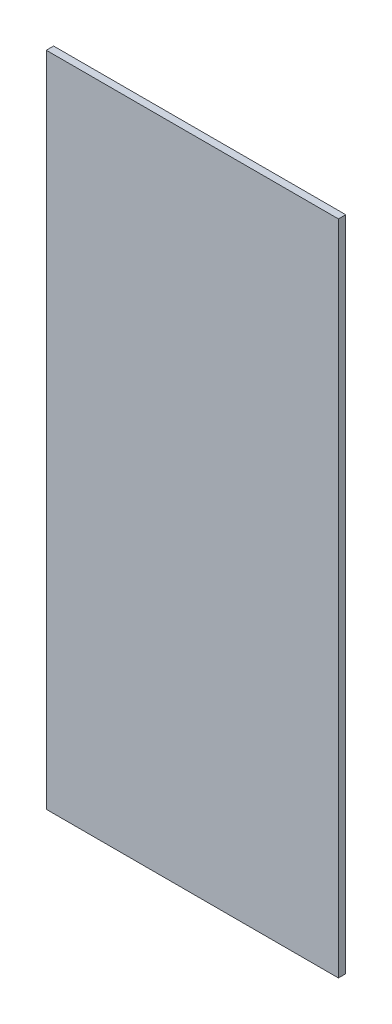
ISO-10303-21;
HEADER;
FILE_DESCRIPTION(('STEP AP214'),'2;1');
FILE_NAME('part.step','',(''),(''),'','','');
FILE_SCHEMA(('AUTOMOTIVE_DESIGN { 1 0 10303 214 1 1 1 1 }'));
ENDSEC;
DATA;
#1=APPLICATION_CONTEXT('core data for automotive mechanical design processes');
#2=APPLICATION_PROTOCOL_DEFINITION('international standard','automotive_design',2000,#1);
#3=PRODUCT_CONTEXT('',#1,'mechanical');
#4=PRODUCT('Part','Part','',(#3));
#5=PRODUCT_RELATED_PRODUCT_CATEGORY('part','',(#4));
#6=PRODUCT_DEFINITION_FORMATION('','',#4);
#7=PRODUCT_DEFINITION_CONTEXT('part definition',#1,'design');
#8=PRODUCT_DEFINITION('design','',#6,#7);
#9=PRODUCT_DEFINITION_SHAPE('','',#8);
#10=(LENGTH_UNIT() NAMED_UNIT(*) SI_UNIT(.MILLI.,.METRE.));
#11=(NAMED_UNIT(*) PLANE_ANGLE_UNIT() SI_UNIT($,.RADIAN.));
#12=(NAMED_UNIT(*) SI_UNIT($,.STERADIAN.) SOLID_ANGLE_UNIT());
#13=UNCERTAINTY_MEASURE_WITH_UNIT(LENGTH_MEASURE(1.E-05),#10,'distance_accuracy_value','');
#14=(GEOMETRIC_REPRESENTATION_CONTEXT(3) GLOBAL_UNCERTAINTY_ASSIGNED_CONTEXT((#13)) GLOBAL_UNIT_ASSIGNED_CONTEXT((#10,
#11,#12)) REPRESENTATION_CONTEXT('',''));
#15=CARTESIAN_POINT('',(0.,0.,0.));
#16=DIRECTION('',(0.,0.,1.));
#17=DIRECTION('',(1.,0.,0.));
#18=AXIS2_PLACEMENT_3D('',#15,#16,#17);
#19=CARTESIAN_POINT('',(0.,0.,2.54));
#20=DIRECTION('',(-1.,0.,0.));
#21=DIRECTION('',(0.,-1.,0.));
#22=AXIS2_PLACEMENT_3D('',#19,#20,#21);
#23=PLANE('',#22);
#24=DIRECTION('',(0.,1.,0.));
#25=VECTOR('',#24,1.);
#26=CARTESIAN_POINT('',(0.,0.,0.));
#27=LINE('',#26,#25);
#28=CARTESIAN_POINT('',(0.,0.,0.));
#29=VERTEX_POINT('',#28);
#30=CARTESIAN_POINT('',(0.,228.6,0.));
#31=VERTEX_POINT('',#30);
#32=EDGE_CURVE('E110',#29,#31,#27,.T.);
#33=ORIENTED_EDGE('',*,*,#32,.F.);
#34=DIRECTION('',(0.,0.,-1.));
#35=VECTOR('',#34,1.);
#36=CARTESIAN_POINT('',(0.,0.,2.54));
#37=LINE('',#36,#35);
#38=CARTESIAN_POINT('',(0.,0.,2.54));
#39=VERTEX_POINT('',#38);
#40=EDGE_CURVE('E11',#39,#29,#37,.T.);
#41=ORIENTED_EDGE('',*,*,#40,.F.);
#42=DIRECTION('',(0.,1.,0.));
#43=VECTOR('',#42,1.);
#44=CARTESIAN_POINT('',(0.,0.,2.54));
#45=LINE('',#44,#43);
#46=CARTESIAN_POINT('',(0.,228.6,2.54));
#47=VERTEX_POINT('',#46);
#48=EDGE_CURVE('E103',#39,#47,#45,.T.);
#49=ORIENTED_EDGE('',*,*,#48,.T.);
#50=DIRECTION('',(0.,0.,-1.));
#51=VECTOR('',#50,1.);
#52=CARTESIAN_POINT('',(0.,228.6,2.54));
#53=LINE('',#52,#51);
#54=EDGE_CURVE('E42',#47,#31,#53,.T.);
#55=ORIENTED_EDGE('',*,*,#54,.T.);
#56=EDGE_LOOP('',(#33,#41,#49,#55));
#57=FACE_BOUND('',#56,.T.);
#58=ADVANCED_FACE('F39',(#57),#23,.T.);
#59=CARTESIAN_POINT('',(0.,0.,2.54));
#60=DIRECTION('',(0.,1.,0.));
#61=DIRECTION('',(0.,0.,1.));
#62=AXIS2_PLACEMENT_3D('',#59,#60,#61);
#63=PLANE('',#62);
#64=DIRECTION('',(1.,0.,0.));
#65=VECTOR('',#64,1.);
#66=CARTESIAN_POINT('',(0.,0.,0.));
#67=LINE('',#66,#65);
#68=CARTESIAN_POINT('',(101.6,0.,0.));
#69=VERTEX_POINT('',#68);
#70=EDGE_CURVE('E73',#29,#69,#67,.T.);
#71=ORIENTED_EDGE('',*,*,#70,.T.);
#72=DIRECTION('',(0.,0.,-1.));
#73=VECTOR('',#72,1.);
#74=CARTESIAN_POINT('',(101.6,0.,2.54));
#75=LINE('',#74,#73);
#76=CARTESIAN_POINT('',(101.6,0.,2.54));
#77=VERTEX_POINT('',#76);
#78=EDGE_CURVE('E49',#77,#69,#75,.T.);
#79=ORIENTED_EDGE('',*,*,#78,.F.);
#80=DIRECTION('',(1.,0.,0.));
#81=VECTOR('',#80,1.);
#82=CARTESIAN_POINT('',(0.,0.,2.54));
#83=LINE('',#82,#81);
#84=EDGE_CURVE('E90',#39,#77,#83,.T.);
#85=ORIENTED_EDGE('',*,*,#84,.F.);
#86=ORIENTED_EDGE('',*,*,#40,.T.);
#87=EDGE_LOOP('',(#71,#79,#85,#86));
#88=FACE_BOUND('',#87,.T.);
#89=ADVANCED_FACE('F126',(#88),#63,.F.);
#90=CARTESIAN_POINT('',(101.6,0.,2.54));
#91=DIRECTION('',(-1.,0.,0.));
#92=DIRECTION('',(0.,-1.,0.));
#93=AXIS2_PLACEMENT_3D('',#90,#91,#92);
#94=PLANE('',#93);
#95=DIRECTION('',(0.,1.,0.));
#96=VECTOR('',#95,1.);
#97=CARTESIAN_POINT('',(101.6,0.,0.));
#98=LINE('',#97,#96);
#99=CARTESIAN_POINT('',(101.6,228.6,0.));
#100=VERTEX_POINT('',#99);
#101=EDGE_CURVE('E98',#69,#100,#98,.T.);
#102=ORIENTED_EDGE('',*,*,#101,.T.);
#103=DIRECTION('',(0.,0.,-1.));
#104=VECTOR('',#103,1.);
#105=CARTESIAN_POINT('',(101.6,228.6,2.54));
#106=LINE('',#105,#104);
#107=CARTESIAN_POINT('',(101.6,228.6,2.54));
#108=VERTEX_POINT('',#107);
#109=EDGE_CURVE('E95',#108,#100,#106,.T.);
#110=ORIENTED_EDGE('',*,*,#109,.F.);
#111=DIRECTION('',(0.,1.,0.));
#112=VECTOR('',#111,1.);
#113=CARTESIAN_POINT('',(101.6,0.,2.54));
#114=LINE('',#113,#112);
#115=EDGE_CURVE('E85',#77,#108,#114,.T.);
#116=ORIENTED_EDGE('',*,*,#115,.F.);
#117=ORIENTED_EDGE('',*,*,#78,.T.);
#118=EDGE_LOOP('',(#102,#110,#116,#117));
#119=FACE_BOUND('',#118,.T.);
#120=ADVANCED_FACE('F96',(#119),#94,.F.);
#121=CARTESIAN_POINT('',(0.,228.6,2.54));
#122=DIRECTION('',(0.,1.,0.));
#123=DIRECTION('',(0.,0.,1.));
#124=AXIS2_PLACEMENT_3D('',#121,#122,#123);
#125=PLANE('',#124);
#126=DIRECTION('',(1.,0.,0.));
#127=VECTOR('',#126,1.);
#128=CARTESIAN_POINT('',(0.,228.6,0.));
#129=LINE('',#128,#127);
#130=EDGE_CURVE('E114',#31,#100,#129,.T.);
#131=ORIENTED_EDGE('',*,*,#130,.F.);
#132=ORIENTED_EDGE('',*,*,#54,.F.);
#133=DIRECTION('',(1.,0.,0.));
#134=VECTOR('',#133,1.);
#135=CARTESIAN_POINT('',(0.,228.6,2.54));
#136=LINE('',#135,#134);
#137=EDGE_CURVE('E89',#47,#108,#136,.T.);
#138=ORIENTED_EDGE('',*,*,#137,.T.);
#139=ORIENTED_EDGE('',*,*,#109,.T.);
#140=EDGE_LOOP('',(#131,#132,#138,#139));
#141=FACE_BOUND('',#140,.T.);
#142=ADVANCED_FACE('F101',(#141),#125,.T.);
#143=CARTESIAN_POINT('',(0.,0.,2.54));
#144=DIRECTION('',(0.,0.,-1.));
#145=DIRECTION('',(-1.,0.,0.));
#146=AXIS2_PLACEMENT_3D('',#143,#144,#145);
#147=PLANE('',#146);
#148=ORIENTED_EDGE('',*,*,#48,.F.);
#149=ORIENTED_EDGE('',*,*,#84,.T.);
#150=ORIENTED_EDGE('',*,*,#115,.T.);
#151=ORIENTED_EDGE('',*,*,#137,.F.);
#152=EDGE_LOOP('',(#148,#149,#150,#151));
#153=FACE_BOUND('',#152,.T.);
#154=ADVANCED_FACE('F88',(#153),#147,.F.);
#155=CARTESIAN_POINT('',(0.,0.,0.));
#156=DIRECTION('',(0.,0.,-1.));
#157=DIRECTION('',(-1.,0.,0.));
#158=AXIS2_PLACEMENT_3D('',#155,#156,#157);
#159=PLANE('',#158);
#160=ORIENTED_EDGE('',*,*,#32,.T.);
#161=ORIENTED_EDGE('',*,*,#130,.T.);
#162=ORIENTED_EDGE('',*,*,#101,.F.);
#163=ORIENTED_EDGE('',*,*,#70,.F.);
#164=EDGE_LOOP('',(#160,#161,#162,#163));
#165=FACE_BOUND('',#164,.T.);
#166=ADVANCED_FACE('F123',(#165),#159,.T.);
#167=CLOSED_SHELL('',(#58,#89,#120,#142,#154,#166));
#168=MANIFOLD_SOLID_BREP('B2',#167);
#169=ADVANCED_BREP_SHAPE_REPRESENTATION('',(#18,#168),#14);
#170=SHAPE_DEFINITION_REPRESENTATION(#9,#169);
ENDSEC;
END-ISO-10303-21;
